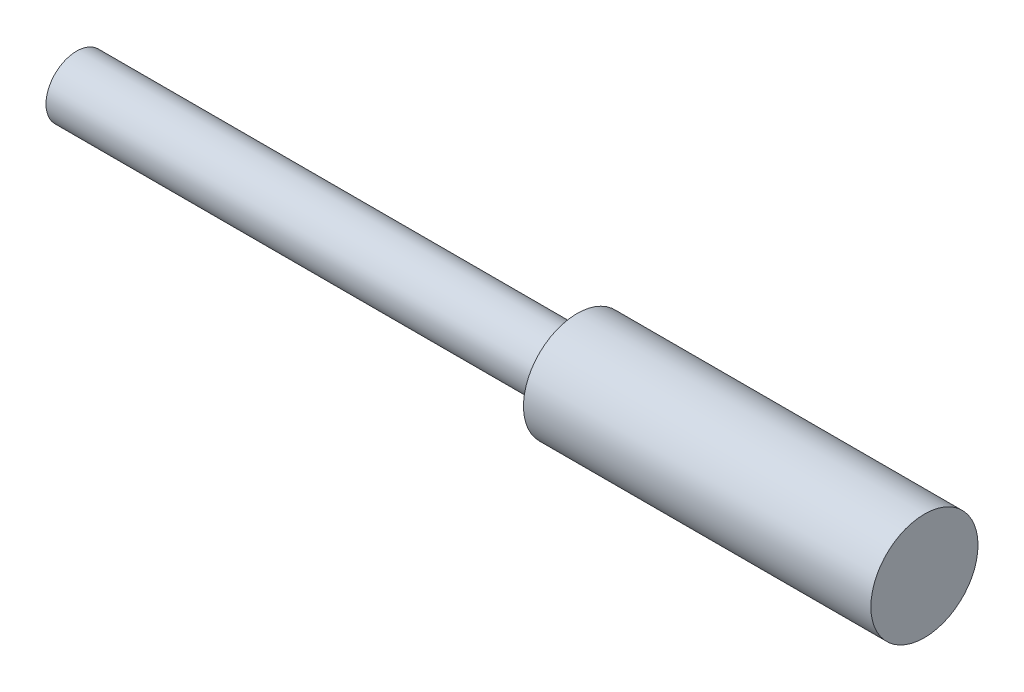
ISO-10303-21;
HEADER;
FILE_DESCRIPTION(('STEP AP214'),'2;1');
FILE_NAME('part.step','',(''),(''),'','','');
FILE_SCHEMA(('AUTOMOTIVE_DESIGN { 1 0 10303 214 1 1 1 1 }'));
ENDSEC;
DATA;
#1=APPLICATION_CONTEXT('core data for automotive mechanical design processes');
#2=APPLICATION_PROTOCOL_DEFINITION('international standard','automotive_design',2000,#1);
#3=PRODUCT_CONTEXT('',#1,'mechanical');
#4=PRODUCT('Part','Part','',(#3));
#5=PRODUCT_RELATED_PRODUCT_CATEGORY('part','',(#4));
#6=PRODUCT_DEFINITION_FORMATION('','',#4);
#7=PRODUCT_DEFINITION_CONTEXT('part definition',#1,'design');
#8=PRODUCT_DEFINITION('design','',#6,#7);
#9=PRODUCT_DEFINITION_SHAPE('','',#8);
#10=(LENGTH_UNIT() NAMED_UNIT(*) SI_UNIT(.MILLI.,.METRE.));
#11=(NAMED_UNIT(*) PLANE_ANGLE_UNIT() SI_UNIT($,.RADIAN.));
#12=(NAMED_UNIT(*) SI_UNIT($,.STERADIAN.) SOLID_ANGLE_UNIT());
#13=UNCERTAINTY_MEASURE_WITH_UNIT(LENGTH_MEASURE(1.E-05),#10,'distance_accuracy_value','');
#14=(GEOMETRIC_REPRESENTATION_CONTEXT(3) GLOBAL_UNCERTAINTY_ASSIGNED_CONTEXT((#13)) GLOBAL_UNIT_ASSIGNED_CONTEXT((#10,
#11,#12)) REPRESENTATION_CONTEXT('',''));
#15=CARTESIAN_POINT('',(0.,0.,0.));
#16=DIRECTION('',(0.,0.,1.));
#17=DIRECTION('',(1.,0.,0.));
#18=AXIS2_PLACEMENT_3D('',#15,#16,#17);
#19=CARTESIAN_POINT('',(2612.4064360468,11.5000000000001,20.1106));
#20=DIRECTION('',(-1.,0.,0.));
#21=DIRECTION('',(0.,0.,1.));
#22=AXIS2_PLACEMENT_3D('',#19,#20,#21);
#23=CYLINDRICAL_SURFACE('',#22,2.);
#24=CARTESIAN_POINT('',(2551.34958179731,11.5000000000001,20.1106));
#25=DIRECTION('',(-1.,0.,0.));
#26=DIRECTION('',(0.,0.,1.));
#27=AXIS2_PLACEMENT_3D('',#24,#25,#26);
#28=CIRCLE('',#27,2.);
#29=CARTESIAN_POINT('',(2551.34958179731,11.5000000000001,22.1106));
#30=VERTEX_POINT('',#29);
#31=EDGE_CURVE('E10',#30,#30,#28,.T.);
#32=ORIENTED_EDGE('',*,*,#31,.F.);
#33=EDGE_LOOP('',(#32));
#34=FACE_BOUND('',#33,.T.);
#35=CARTESIAN_POINT('',(2584.04958179731,11.5000000000001,20.1106));
#36=DIRECTION('',(1.,0.,0.));
#37=DIRECTION('',(0.,0.,-1.));
#38=AXIS2_PLACEMENT_3D('',#35,#36,#37);
#39=CIRCLE('',#38,2.);
#40=CARTESIAN_POINT('',(2584.04958179731,11.5000000000001,18.1106));
#41=VERTEX_POINT('',#40);
#42=EDGE_CURVE('E34',#41,#41,#39,.F.);
#43=ORIENTED_EDGE('',*,*,#42,.T.);
#44=EDGE_LOOP('',(#43));
#45=FACE_BOUND('',#44,.T.);
#46=ADVANCED_FACE('F31',(#34,#45),#23,.T.);
#47=CARTESIAN_POINT('',(2551.34958179731,11.5000000000001,20.1106));
#48=DIRECTION('',(-1.,0.,0.));
#49=DIRECTION('',(0.,0.,1.));
#50=AXIS2_PLACEMENT_3D('',#47,#48,#49);
#51=PLANE('',#50);
#52=ORIENTED_EDGE('',*,*,#31,.T.);
#53=EDGE_LOOP('',(#52));
#54=FACE_BOUND('',#53,.T.);
#55=ADVANCED_FACE('F62',(#54),#51,.T.);
#56=CARTESIAN_POINT('',(2574.15008686069,11.5000000000001,20.1106));
#57=DIRECTION('',(1.,0.,0.));
#58=DIRECTION('',(0.,0.,-1.));
#59=AXIS2_PLACEMENT_3D('',#56,#57,#58);
#60=CYLINDRICAL_SURFACE('',#59,3.5);
#61=CARTESIAN_POINT('',(2584.04958179731,11.5000000000001,20.1106));
#62=DIRECTION('',(1.,0.,0.));
#63=DIRECTION('',(0.,0.,-1.));
#64=AXIS2_PLACEMENT_3D('',#61,#62,#63);
#65=CIRCLE('',#64,3.5);
#66=CARTESIAN_POINT('',(2584.04958179731,11.5000000000001,16.6106));
#67=VERTEX_POINT('',#66);
#68=EDGE_CURVE('E41',#67,#67,#65,.T.);
#69=ORIENTED_EDGE('',*,*,#68,.T.);
#70=EDGE_LOOP('',(#69));
#71=FACE_BOUND('',#70,.T.);
#72=CARTESIAN_POINT('',(2606.74958179731,11.5000000000001,20.1106));
#73=DIRECTION('',(-1.,0.,0.));
#74=DIRECTION('',(0.,0.,1.));
#75=AXIS2_PLACEMENT_3D('',#72,#73,#74);
#76=CIRCLE('',#75,3.5);
#77=CARTESIAN_POINT('',(2606.74958179731,11.5000000000001,23.6106));
#78=VERTEX_POINT('',#77);
#79=EDGE_CURVE('E45',#78,#78,#76,.T.);
#80=ORIENTED_EDGE('',*,*,#79,.T.);
#81=EDGE_LOOP('',(#80));
#82=FACE_BOUND('',#81,.T.);
#83=ADVANCED_FACE('F49',(#71,#82),#60,.T.);
#84=CARTESIAN_POINT('',(2584.04958179731,11.5000000000001,11.5));
#85=DIRECTION('',(1.,0.,0.));
#86=DIRECTION('',(0.,0.,-1.));
#87=AXIS2_PLACEMENT_3D('',#84,#85,#86);
#88=PLANE('',#87);
#89=ORIENTED_EDGE('',*,*,#42,.F.);
#90=EDGE_LOOP('',(#89));
#91=FACE_BOUND('',#90,.T.);
#92=ORIENTED_EDGE('',*,*,#68,.F.);
#93=EDGE_LOOP('',(#92));
#94=FACE_BOUND('',#93,.T.);
#95=ADVANCED_FACE('F53',(#91,#94),#88,.F.);
#96=CARTESIAN_POINT('',(2606.74958179731,11.5000000000001,11.5));
#97=DIRECTION('',(-1.,0.,0.));
#98=DIRECTION('',(0.,0.,1.));
#99=AXIS2_PLACEMENT_3D('',#96,#97,#98);
#100=PLANE('',#99);
#101=ORIENTED_EDGE('',*,*,#79,.F.);
#102=EDGE_LOOP('',(#101));
#103=FACE_BOUND('',#102,.T.);
#104=ADVANCED_FACE('F51',(#103),#100,.F.);
#105=CLOSED_SHELL('',(#46,#55,#83,#95,#104));
#106=MANIFOLD_SOLID_BREP('B2',#105);
#107=ADVANCED_BREP_SHAPE_REPRESENTATION('',(#18,#106),#14);
#108=SHAPE_DEFINITION_REPRESENTATION(#9,#107);
ENDSEC;
END-ISO-10303-21;
